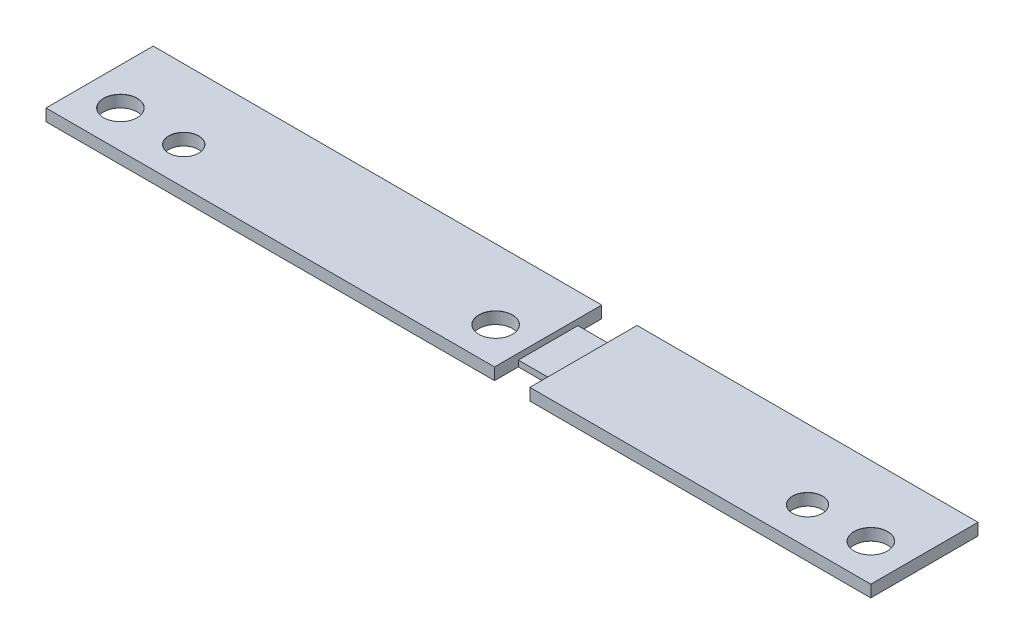
ISO-10303-21;
HEADER;
FILE_DESCRIPTION(('STEP AP214'),'2;1');
FILE_NAME('part.step','',(''),(''),'','','');
FILE_SCHEMA(('AUTOMOTIVE_DESIGN { 1 0 10303 214 1 1 1 1 }'));
ENDSEC;
DATA;
#1=APPLICATION_CONTEXT('core data for automotive mechanical design processes');
#2=APPLICATION_PROTOCOL_DEFINITION('international standard','automotive_design',2000,#1);
#3=PRODUCT_CONTEXT('',#1,'mechanical');
#4=PRODUCT('Part','Part','',(#3));
#5=PRODUCT_RELATED_PRODUCT_CATEGORY('part','',(#4));
#6=PRODUCT_DEFINITION_FORMATION('','',#4);
#7=PRODUCT_DEFINITION_CONTEXT('part definition',#1,'design');
#8=PRODUCT_DEFINITION('design','',#6,#7);
#9=PRODUCT_DEFINITION_SHAPE('','',#8);
#10=(LENGTH_UNIT() NAMED_UNIT(*) SI_UNIT(.MILLI.,.METRE.));
#11=(NAMED_UNIT(*) PLANE_ANGLE_UNIT() SI_UNIT($,.RADIAN.));
#12=(NAMED_UNIT(*) SI_UNIT($,.STERADIAN.) SOLID_ANGLE_UNIT());
#13=UNCERTAINTY_MEASURE_WITH_UNIT(LENGTH_MEASURE(1.E-05),#10,'distance_accuracy_value','');
#14=(GEOMETRIC_REPRESENTATION_CONTEXT(3) GLOBAL_UNCERTAINTY_ASSIGNED_CONTEXT((#13)) GLOBAL_UNIT_ASSIGNED_CONTEXT((#10,
#11,#12)) REPRESENTATION_CONTEXT('',''));
#15=CARTESIAN_POINT('',(0.,0.,0.));
#16=DIRECTION('',(0.,0.,1.));
#17=DIRECTION('',(1.,0.,0.));
#18=AXIS2_PLACEMENT_3D('',#15,#16,#17);
#19=CARTESIAN_POINT('',(0.,0.,0.));
#20=DIRECTION('',(0.,1.,0.));
#21=DIRECTION('',(0.,0.,1.));
#22=AXIS2_PLACEMENT_3D('',#19,#20,#21);
#23=PLANE('',#22);
#24=CARTESIAN_POINT('',(-83.8,0.,4.39999999999999));
#25=DIRECTION('',(0.,1.,0.));
#26=DIRECTION('',(0.,0.,1.));
#27=AXIS2_PLACEMENT_3D('',#24,#25,#26);
#28=CIRCLE('',#27,4.025);
#29=CARTESIAN_POINT('',(-83.8,0.,8.425));
#30=VERTEX_POINT('',#29);
#31=EDGE_CURVE('E569',#30,#30,#28,.T.);
#32=ORIENTED_EDGE('',*,*,#31,.F.);
#33=EDGE_LOOP('',(#32));
#34=FACE_BOUND('',#33,.T.);
#35=CARTESIAN_POINT('',(-100.8,0.,4.39999999999999));
#36=DIRECTION('',(0.,1.,0.));
#37=DIRECTION('',(0.,0.,1.));
#38=AXIS2_PLACEMENT_3D('',#35,#36,#37);
#39=CIRCLE('',#38,4.525);
#40=CARTESIAN_POINT('',(-100.8,0.,8.925));
#41=VERTEX_POINT('',#40);
#42=EDGE_CURVE('E585',#41,#41,#39,.T.);
#43=ORIENTED_EDGE('',*,*,#42,.F.);
#44=EDGE_LOOP('',(#43));
#45=FACE_BOUND('',#44,.T.);
#46=CARTESIAN_POINT('',(0.,0.,4.39999999999999));
#47=DIRECTION('',(0.,1.,0.));
#48=DIRECTION('',(0.,0.,1.));
#49=AXIS2_PLACEMENT_3D('',#46,#47,#48);
#50=CIRCLE('',#49,4.525);
#51=CARTESIAN_POINT('',(0.,0.,8.925));
#52=VERTEX_POINT('',#51);
#53=EDGE_CURVE('E381',#52,#52,#50,.T.);
#54=ORIENTED_EDGE('',*,*,#53,.F.);
#55=EDGE_LOOP('',(#54));
#56=FACE_BOUND('',#55,.T.);
#57=DIRECTION('',(1.,0.,0.));
#58=VECTOR('',#57,1.);
#59=CARTESIAN_POINT('',(-110.8,0.,14.4));
#60=LINE('',#59,#58);
#61=CARTESIAN_POINT('',(-110.8,0.,14.4));
#62=VERTEX_POINT('',#61);
#63=CARTESIAN_POINT('',(9.7,0.,14.4));
#64=VERTEX_POINT('',#63);
#65=EDGE_CURVE('E201',#62,#64,#60,.T.);
#66=ORIENTED_EDGE('',*,*,#65,.T.);
#67=DIRECTION('',(0.,0.,1.));
#68=VECTOR('',#67,1.);
#69=CARTESIAN_POINT('',(9.7,0.,-14.4));
#70=LINE('',#69,#68);
#71=CARTESIAN_POINT('',(9.7,0.,-14.4));
#72=VERTEX_POINT('',#71);
#73=EDGE_CURVE('E164',#72,#64,#70,.T.);
#74=ORIENTED_EDGE('',*,*,#73,.F.);
#75=DIRECTION('',(-1.,0.,0.));
#76=VECTOR('',#75,1.);
#77=CARTESIAN_POINT('',(-110.8,0.,-14.4));
#78=LINE('',#77,#76);
#79=CARTESIAN_POINT('',(-110.8,0.,-14.4));
#80=VERTEX_POINT('',#79);
#81=EDGE_CURVE('E218',#72,#80,#78,.T.);
#82=ORIENTED_EDGE('',*,*,#81,.T.);
#83=DIRECTION('',(0.,0.,1.));
#84=VECTOR('',#83,1.);
#85=CARTESIAN_POINT('',(-110.8,0.,-14.4));
#86=LINE('',#85,#84);
#87=EDGE_CURVE('E222',#80,#62,#86,.T.);
#88=ORIENTED_EDGE('',*,*,#87,.T.);
#89=EDGE_LOOP('',(#66,#74,#82,#88));
#90=FACE_BOUND('',#89,.T.);
#91=ADVANCED_FACE('F43',(#34,#45,#56,#90),#23,.T.);
#92=CARTESIAN_POINT('',(-110.8,-3.2,14.4));
#93=DIRECTION('',(0.,0.,1.));
#94=DIRECTION('',(1.,0.,0.));
#95=AXIS2_PLACEMENT_3D('',#92,#93,#94);
#96=PLANE('',#95);
#97=DIRECTION('',(0.,1.,0.));
#98=VECTOR('',#97,1.);
#99=CARTESIAN_POINT('',(9.7,-3.201,14.4));
#100=LINE('',#99,#98);
#101=CARTESIAN_POINT('',(9.69999999999997,-3.2,14.4));
#102=VERTEX_POINT('',#101);
#103=EDGE_CURVE('E172',#102,#64,#100,.T.);
#104=ORIENTED_EDGE('',*,*,#103,.T.);
#105=ORIENTED_EDGE('',*,*,#65,.F.);
#106=DIRECTION('',(0.,1.,0.));
#107=VECTOR('',#106,1.);
#108=CARTESIAN_POINT('',(-110.8,-3.2,14.4));
#109=LINE('',#108,#107);
#110=CARTESIAN_POINT('',(-110.8,-3.2,14.4));
#111=VERTEX_POINT('',#110);
#112=EDGE_CURVE('E53',#111,#62,#109,.T.);
#113=ORIENTED_EDGE('',*,*,#112,.F.);
#114=DIRECTION('',(1.,0.,0.));
#115=VECTOR('',#114,1.);
#116=CARTESIAN_POINT('',(-110.8,-3.2,14.4));
#117=LINE('',#116,#115);
#118=EDGE_CURVE('E211',#111,#102,#117,.T.);
#119=ORIENTED_EDGE('',*,*,#118,.T.);
#120=EDGE_LOOP('',(#104,#105,#113,#119));
#121=FACE_BOUND('',#120,.T.);
#122=ADVANCED_FACE('F303',(#121),#96,.T.);
#123=CARTESIAN_POINT('',(-110.8,-3.2,-14.4));
#124=DIRECTION('',(0.,0.,-1.));
#125=DIRECTION('',(-1.,0.,0.));
#126=AXIS2_PLACEMENT_3D('',#123,#124,#125);
#127=PLANE('',#126);
#128=DIRECTION('',(0.,1.,0.));
#129=VECTOR('',#128,1.);
#130=CARTESIAN_POINT('',(9.7,-3.201,-14.4));
#131=LINE('',#130,#129);
#132=CARTESIAN_POINT('',(9.7,-3.2,-14.4));
#133=VERTEX_POINT('',#132);
#134=EDGE_CURVE('E171',#133,#72,#131,.T.);
#135=ORIENTED_EDGE('',*,*,#134,.F.);
#136=DIRECTION('',(-1.,0.,0.));
#137=VECTOR('',#136,1.);
#138=CARTESIAN_POINT('',(-110.8,-3.2,-14.4));
#139=LINE('',#138,#137);
#140=CARTESIAN_POINT('',(-110.8,-3.2,-14.4));
#141=VERTEX_POINT('',#140);
#142=EDGE_CURVE('E200',#133,#141,#139,.T.);
#143=ORIENTED_EDGE('',*,*,#142,.T.);
#144=DIRECTION('',(0.,1.,0.));
#145=VECTOR('',#144,1.);
#146=CARTESIAN_POINT('',(-110.8,-3.2,-14.4));
#147=LINE('',#146,#145);
#148=EDGE_CURVE('E231',#141,#80,#147,.T.);
#149=ORIENTED_EDGE('',*,*,#148,.T.);
#150=ORIENTED_EDGE('',*,*,#81,.F.);
#151=EDGE_LOOP('',(#135,#143,#149,#150));
#152=FACE_BOUND('',#151,.T.);
#153=ADVANCED_FACE('F295',(#152),#127,.T.);
#154=CARTESIAN_POINT('',(110.8,-3.2,-14.4));
#155=DIRECTION('',(1.,0.,0.));
#156=DIRECTION('',(0.,0.,-1.));
#157=AXIS2_PLACEMENT_3D('',#154,#155,#156);
#158=PLANE('',#157);
#159=DIRECTION('',(0.,0.,-1.));
#160=VECTOR('',#159,1.);
#161=CARTESIAN_POINT('',(110.8,0.,-14.4));
#162=LINE('',#161,#160);
#163=CARTESIAN_POINT('',(110.8,0.,14.4));
#164=VERTEX_POINT('',#163);
#165=CARTESIAN_POINT('',(110.8,0.,-14.4));
#166=VERTEX_POINT('',#165);
#167=EDGE_CURVE('E170',#164,#166,#162,.T.);
#168=ORIENTED_EDGE('',*,*,#167,.F.);
#169=DIRECTION('',(0.,1.,0.));
#170=VECTOR('',#169,1.);
#171=CARTESIAN_POINT('',(110.8,-3.2,14.4));
#172=LINE('',#171,#170);
#173=CARTESIAN_POINT('',(110.8,-3.2,14.4));
#174=VERTEX_POINT('',#173);
#175=EDGE_CURVE('E11',#174,#164,#172,.T.);
#176=ORIENTED_EDGE('',*,*,#175,.F.);
#177=DIRECTION('',(0.,0.,-1.));
#178=VECTOR('',#177,1.);
#179=CARTESIAN_POINT('',(110.8,-3.2,-14.4));
#180=LINE('',#179,#178);
#181=CARTESIAN_POINT('',(110.8,-3.2,-14.4));
#182=VERTEX_POINT('',#181);
#183=EDGE_CURVE('E196',#174,#182,#180,.T.);
#184=ORIENTED_EDGE('',*,*,#183,.T.);
#185=DIRECTION('',(0.,1.,0.));
#186=VECTOR('',#185,1.);
#187=CARTESIAN_POINT('',(110.8,-3.2,-14.4));
#188=LINE('',#187,#186);
#189=EDGE_CURVE('E47',#182,#166,#188,.T.);
#190=ORIENTED_EDGE('',*,*,#189,.T.);
#191=EDGE_LOOP('',(#168,#176,#184,#190));
#192=FACE_BOUND('',#191,.T.);
#193=ADVANCED_FACE('F45',(#192),#158,.T.);
#194=DIRECTION('',(0.,1.,0.));
#195=VECTOR('',#194,1.);
#196=CARTESIAN_POINT('',(19.2,-3.201,14.4));
#197=LINE('',#196,#195);
#198=CARTESIAN_POINT('',(19.2,-3.2,14.4));
#199=VERTEX_POINT('',#198);
#200=CARTESIAN_POINT('',(19.1999999999999,0.,14.4));
#201=VERTEX_POINT('',#200);
#202=EDGE_CURVE('E177',#199,#201,#197,.T.);
#203=ORIENTED_EDGE('',*,*,#202,.F.);
#204=EDGE_CURVE('E210',#199,#174,#117,.T.);
#205=ORIENTED_EDGE('',*,*,#204,.T.);
#206=ORIENTED_EDGE('',*,*,#175,.T.);
#207=EDGE_CURVE('E226',#201,#164,#60,.T.);
#208=ORIENTED_EDGE('',*,*,#207,.F.);
#209=EDGE_LOOP('',(#203,#205,#206,#208));
#210=FACE_BOUND('',#209,.T.);
#211=ADVANCED_FACE('F255',(#210),#96,.T.);
#212=CARTESIAN_POINT('',(-110.8,-3.2,-14.4));
#213=DIRECTION('',(-1.,0.,0.));
#214=DIRECTION('',(0.,0.,1.));
#215=AXIS2_PLACEMENT_3D('',#212,#213,#214);
#216=PLANE('',#215);
#217=ORIENTED_EDGE('',*,*,#87,.F.);
#218=ORIENTED_EDGE('',*,*,#148,.F.);
#219=DIRECTION('',(0.,0.,1.));
#220=VECTOR('',#219,1.);
#221=CARTESIAN_POINT('',(-110.8,-3.2,-14.4));
#222=LINE('',#221,#220);
#223=EDGE_CURVE('E206',#141,#111,#222,.T.);
#224=ORIENTED_EDGE('',*,*,#223,.T.);
#225=ORIENTED_EDGE('',*,*,#112,.T.);
#226=EDGE_LOOP('',(#217,#218,#224,#225));
#227=FACE_BOUND('',#226,.T.);
#228=ADVANCED_FACE('F298',(#227),#216,.T.);
#229=DIRECTION('',(0.,1.,0.));
#230=VECTOR('',#229,1.);
#231=CARTESIAN_POINT('',(19.2,-3.201,-14.4));
#232=LINE('',#231,#230);
#233=CARTESIAN_POINT('',(19.2,-3.2,-14.4));
#234=VERTEX_POINT('',#233);
#235=CARTESIAN_POINT('',(19.2,0.,-14.4));
#236=VERTEX_POINT('',#235);
#237=EDGE_CURVE('E162',#234,#236,#232,.T.);
#238=ORIENTED_EDGE('',*,*,#237,.T.);
#239=EDGE_CURVE('E219',#166,#236,#78,.T.);
#240=ORIENTED_EDGE('',*,*,#239,.F.);
#241=ORIENTED_EDGE('',*,*,#189,.F.);
#242=EDGE_CURVE('E202',#182,#234,#139,.T.);
#243=ORIENTED_EDGE('',*,*,#242,.T.);
#244=EDGE_LOOP('',(#238,#240,#241,#243));
#245=FACE_BOUND('',#244,.T.);
#246=ADVANCED_FACE('F249',(#245),#127,.T.);
#247=CARTESIAN_POINT('',(0.,-3.2,0.));
#248=DIRECTION('',(0.,1.,0.));
#249=DIRECTION('',(0.,0.,1.));
#250=AXIS2_PLACEMENT_3D('',#247,#248,#249);
#251=PLANE('',#250);
#252=CARTESIAN_POINT('',(83.8,-3.2,4.39999999999998));
#253=DIRECTION('',(0.,1.,0.));
#254=DIRECTION('',(0.,0.,1.));
#255=AXIS2_PLACEMENT_3D('',#252,#253,#254);
#256=CIRCLE('',#255,4.025);
#257=CARTESIAN_POINT('',(83.8,-3.2,8.42499999999998));
#258=VERTEX_POINT('',#257);
#259=EDGE_CURVE('E552',#258,#258,#256,.T.);
#260=ORIENTED_EDGE('',*,*,#259,.T.);
#261=EDGE_LOOP('',(#260));
#262=FACE_BOUND('',#261,.T.);
#263=CARTESIAN_POINT('',(-83.8,-3.2,4.39999999999999));
#264=DIRECTION('',(0.,1.,0.));
#265=DIRECTION('',(0.,0.,1.));
#266=AXIS2_PLACEMENT_3D('',#263,#264,#265);
#267=CIRCLE('',#266,4.025);
#268=CARTESIAN_POINT('',(-83.8,-3.2,8.425));
#269=VERTEX_POINT('',#268);
#270=EDGE_CURVE('E565',#269,#269,#267,.T.);
#271=ORIENTED_EDGE('',*,*,#270,.T.);
#272=EDGE_LOOP('',(#271));
#273=FACE_BOUND('',#272,.T.);
#274=CARTESIAN_POINT('',(-100.8,-3.2,4.39999999999999));
#275=DIRECTION('',(0.,1.,0.));
#276=DIRECTION('',(0.,0.,1.));
#277=AXIS2_PLACEMENT_3D('',#274,#275,#276);
#278=CIRCLE('',#277,4.525);
#279=CARTESIAN_POINT('',(-100.8,-3.2,8.925));
#280=VERTEX_POINT('',#279);
#281=EDGE_CURVE('E581',#280,#280,#278,.T.);
#282=ORIENTED_EDGE('',*,*,#281,.T.);
#283=EDGE_LOOP('',(#282));
#284=FACE_BOUND('',#283,.T.);
#285=CARTESIAN_POINT('',(100.8,-3.2,4.39999999999999));
#286=DIRECTION('',(0.,1.,0.));
#287=DIRECTION('',(0.,0.,1.));
#288=AXIS2_PLACEMENT_3D('',#285,#286,#287);
#289=CIRCLE('',#288,4.525);
#290=CARTESIAN_POINT('',(100.8,-3.2,8.92499999999999));
#291=VERTEX_POINT('',#290);
#292=EDGE_CURVE('E361',#291,#291,#289,.T.);
#293=ORIENTED_EDGE('',*,*,#292,.T.);
#294=EDGE_LOOP('',(#293));
#295=FACE_BOUND('',#294,.T.);
#296=CARTESIAN_POINT('',(0.,-3.2,4.39999999999999));
#297=DIRECTION('',(0.,1.,0.));
#298=DIRECTION('',(0.,0.,1.));
#299=AXIS2_PLACEMENT_3D('',#296,#297,#298);
#300=CIRCLE('',#299,4.525);
#301=CARTESIAN_POINT('',(0.,-3.2,8.92499999999999));
#302=VERTEX_POINT('',#301);
#303=EDGE_CURVE('E377',#302,#302,#300,.T.);
#304=ORIENTED_EDGE('',*,*,#303,.T.);
#305=EDGE_LOOP('',(#304));
#306=FACE_BOUND('',#305,.T.);
#307=ORIENTED_EDGE('',*,*,#142,.F.);
#308=DIRECTION('',(0.,0.,-1.));
#309=VECTOR('',#308,1.);
#310=CARTESIAN_POINT('',(9.7,-3.2,-14.4));
#311=LINE('',#310,#309);
#312=CARTESIAN_POINT('',(9.7,-3.2,-8.));
#313=VERTEX_POINT('',#312);
#314=EDGE_CURVE('E265',#313,#133,#311,.T.);
#315=ORIENTED_EDGE('',*,*,#314,.F.);
#316=DIRECTION('',(-1.,0.,0.));
#317=VECTOR('',#316,1.);
#318=CARTESIAN_POINT('',(9.7,-3.2,-8.));
#319=LINE('',#318,#317);
#320=CARTESIAN_POINT('',(19.2,-3.2,-8.));
#321=VERTEX_POINT('',#320);
#322=EDGE_CURVE('E154',#321,#313,#319,.T.);
#323=ORIENTED_EDGE('',*,*,#322,.F.);
#324=DIRECTION('',(0.,0.,1.));
#325=VECTOR('',#324,1.);
#326=CARTESIAN_POINT('',(19.2,-3.2,-14.4));
#327=LINE('',#326,#325);
#328=EDGE_CURVE('E195',#234,#321,#327,.T.);
#329=ORIENTED_EDGE('',*,*,#328,.F.);
#330=ORIENTED_EDGE('',*,*,#242,.F.);
#331=ORIENTED_EDGE('',*,*,#183,.F.);
#332=ORIENTED_EDGE('',*,*,#204,.F.);
#333=DIRECTION('',(0.,0.,1.));
#334=VECTOR('',#333,1.);
#335=CARTESIAN_POINT('',(19.2,-3.2,14.4));
#336=LINE('',#335,#334);
#337=CARTESIAN_POINT('',(19.2,-3.2,8.));
#338=VERTEX_POINT('',#337);
#339=EDGE_CURVE('E192',#338,#199,#336,.T.);
#340=ORIENTED_EDGE('',*,*,#339,.F.);
#341=DIRECTION('',(1.,0.,0.));
#342=VECTOR('',#341,1.);
#343=CARTESIAN_POINT('',(9.7,-3.2,8.));
#344=LINE('',#343,#342);
#345=CARTESIAN_POINT('',(9.7,-3.2,8.));
#346=VERTEX_POINT('',#345);
#347=EDGE_CURVE('E188',#346,#338,#344,.T.);
#348=ORIENTED_EDGE('',*,*,#347,.F.);
#349=DIRECTION('',(0.,0.,-1.));
#350=VECTOR('',#349,1.);
#351=CARTESIAN_POINT('',(9.7,-3.2,14.4));
#352=LINE('',#351,#350);
#353=EDGE_CURVE('E176',#102,#346,#352,.T.);
#354=ORIENTED_EDGE('',*,*,#353,.F.);
#355=ORIENTED_EDGE('',*,*,#118,.F.);
#356=ORIENTED_EDGE('',*,*,#223,.F.);
#357=EDGE_LOOP('',(#307,#315,#323,#329,#330,#331,#332,#340,#348,#354,#355,#356));
#358=FACE_BOUND('',#357,.T.);
#359=ADVANCED_FACE('F259',(#262,#273,#284,#295,#306,#358),#251,.F.);
#360=CARTESIAN_POINT('',(83.8,0.,4.39999999999998));
#361=DIRECTION('',(0.,1.,0.));
#362=DIRECTION('',(0.,0.,1.));
#363=AXIS2_PLACEMENT_3D('',#360,#361,#362);
#364=CIRCLE('',#363,4.025);
#365=CARTESIAN_POINT('',(83.8,0.,8.42499999999998));
#366=VERTEX_POINT('',#365);
#367=EDGE_CURVE('E354',#366,#366,#364,.T.);
#368=ORIENTED_EDGE('',*,*,#367,.F.);
#369=EDGE_LOOP('',(#368));
#370=FACE_BOUND('',#369,.T.);
#371=CARTESIAN_POINT('',(100.8,0.,4.39999999999999));
#372=DIRECTION('',(0.,1.,0.));
#373=DIRECTION('',(0.,0.,1.));
#374=AXIS2_PLACEMENT_3D('',#371,#372,#373);
#375=CIRCLE('',#374,4.525);
#376=CARTESIAN_POINT('',(100.8,0.,8.92499999999999));
#377=VERTEX_POINT('',#376);
#378=EDGE_CURVE('E357',#377,#377,#375,.T.);
#379=ORIENTED_EDGE('',*,*,#378,.F.);
#380=EDGE_LOOP('',(#379));
#381=FACE_BOUND('',#380,.T.);
#382=DIRECTION('',(0.,0.,-1.));
#383=VECTOR('',#382,1.);
#384=CARTESIAN_POINT('',(19.2,0.,-14.4));
#385=LINE('',#384,#383);
#386=EDGE_CURVE('E69',#201,#236,#385,.T.);
#387=ORIENTED_EDGE('',*,*,#386,.F.);
#388=ORIENTED_EDGE('',*,*,#207,.T.);
#389=ORIENTED_EDGE('',*,*,#167,.T.);
#390=ORIENTED_EDGE('',*,*,#239,.T.);
#391=EDGE_LOOP('',(#387,#388,#389,#390));
#392=FACE_BOUND('',#391,.T.);
#393=ADVANCED_FACE('F250',(#370,#381,#392),#23,.T.);
#394=CARTESIAN_POINT('',(9.7,-3.201,8.));
#395=DIRECTION('',(0.,0.,-1.));
#396=DIRECTION('',(-1.,0.,0.));
#397=AXIS2_PLACEMENT_3D('',#394,#395,#396);
#398=PLANE('',#397);
#399=DIRECTION('',(0.,1.,0.));
#400=VECTOR('',#399,1.);
#401=CARTESIAN_POINT('',(19.2,-3.201,8.));
#402=LINE('',#401,#400);
#403=CARTESIAN_POINT('',(19.2,-1.6,8.));
#404=VERTEX_POINT('',#403);
#405=EDGE_CURVE('E180',#338,#404,#402,.T.);
#406=ORIENTED_EDGE('',*,*,#405,.T.);
#407=DIRECTION('',(1.,0.,0.));
#408=VECTOR('',#407,1.);
#409=CARTESIAN_POINT('',(9.7,-1.6,8.));
#410=LINE('',#409,#408);
#411=CARTESIAN_POINT('',(9.7,-1.6,8.));
#412=VERTEX_POINT('',#411);
#413=EDGE_CURVE('E144',#412,#404,#410,.T.);
#414=ORIENTED_EDGE('',*,*,#413,.F.);
#415=DIRECTION('',(0.,1.,0.));
#416=VECTOR('',#415,1.);
#417=CARTESIAN_POINT('',(9.7,-3.201,8.));
#418=LINE('',#417,#416);
#419=EDGE_CURVE('E141',#346,#412,#418,.T.);
#420=ORIENTED_EDGE('',*,*,#419,.F.);
#421=ORIENTED_EDGE('',*,*,#347,.T.);
#422=EDGE_LOOP('',(#406,#414,#420,#421));
#423=FACE_BOUND('',#422,.T.);
#424=ADVANCED_FACE('F308',(#423),#398,.F.);
#425=CARTESIAN_POINT('',(9.7,-3.201,-14.4));
#426=DIRECTION('',(-1.,0.,0.));
#427=DIRECTION('',(0.,0.,1.));
#428=AXIS2_PLACEMENT_3D('',#425,#426,#427);
#429=PLANE('',#428);
#430=ORIENTED_EDGE('',*,*,#314,.T.);
#431=ORIENTED_EDGE('',*,*,#134,.T.);
#432=ORIENTED_EDGE('',*,*,#73,.T.);
#433=ORIENTED_EDGE('',*,*,#103,.F.);
#434=ORIENTED_EDGE('',*,*,#353,.T.);
#435=ORIENTED_EDGE('',*,*,#419,.T.);
#436=DIRECTION('',(0.,0.,1.));
#437=VECTOR('',#436,1.);
#438=CARTESIAN_POINT('',(9.7,-1.6,-14.401));
#439=LINE('',#438,#437);
#440=CARTESIAN_POINT('',(9.7,-1.6,-8.));
#441=VERTEX_POINT('',#440);
#442=EDGE_CURVE('E135',#441,#412,#439,.T.);
#443=ORIENTED_EDGE('',*,*,#442,.F.);
#444=DIRECTION('',(0.,1.,0.));
#445=VECTOR('',#444,1.);
#446=CARTESIAN_POINT('',(9.7,-3.201,-8.));
#447=LINE('',#446,#445);
#448=EDGE_CURVE('E138',#313,#441,#447,.T.);
#449=ORIENTED_EDGE('',*,*,#448,.F.);
#450=EDGE_LOOP('',(#430,#431,#432,#433,#434,#435,#443,#449));
#451=FACE_BOUND('',#450,.T.);
#452=ADVANCED_FACE('F136',(#451),#429,.F.);
#453=CARTESIAN_POINT('',(19.2,-3.201,-14.4));
#454=DIRECTION('',(1.,0.,0.));
#455=DIRECTION('',(0.,0.,-1.));
#456=AXIS2_PLACEMENT_3D('',#453,#454,#455);
#457=PLANE('',#456);
#458=ORIENTED_EDGE('',*,*,#328,.T.);
#459=DIRECTION('',(0.,1.,0.));
#460=VECTOR('',#459,1.);
#461=CARTESIAN_POINT('',(19.2,-3.201,-8.));
#462=LINE('',#461,#460);
#463=CARTESIAN_POINT('',(19.2,-1.6,-8.));
#464=VERTEX_POINT('',#463);
#465=EDGE_CURVE('E157',#321,#464,#462,.T.);
#466=ORIENTED_EDGE('',*,*,#465,.T.);
#467=DIRECTION('',(0.,0.,1.));
#468=VECTOR('',#467,1.);
#469=CARTESIAN_POINT('',(19.2,-1.6,-14.401));
#470=LINE('',#469,#468);
#471=EDGE_CURVE('E61',#464,#404,#470,.T.);
#472=ORIENTED_EDGE('',*,*,#471,.T.);
#473=ORIENTED_EDGE('',*,*,#405,.F.);
#474=ORIENTED_EDGE('',*,*,#339,.T.);
#475=ORIENTED_EDGE('',*,*,#202,.T.);
#476=ORIENTED_EDGE('',*,*,#386,.T.);
#477=ORIENTED_EDGE('',*,*,#237,.F.);
#478=EDGE_LOOP('',(#458,#466,#472,#473,#474,#475,#476,#477));
#479=FACE_BOUND('',#478,.T.);
#480=ADVANCED_FACE('F321',(#479),#457,.F.);
#481=CARTESIAN_POINT('',(9.7,-3.201,-8.));
#482=DIRECTION('',(0.,0.,1.));
#483=DIRECTION('',(1.,0.,0.));
#484=AXIS2_PLACEMENT_3D('',#481,#482,#483);
#485=PLANE('',#484);
#486=ORIENTED_EDGE('',*,*,#448,.T.);
#487=DIRECTION('',(-1.,0.,0.));
#488=VECTOR('',#487,1.);
#489=CARTESIAN_POINT('',(9.7,-1.6,-8.));
#490=LINE('',#489,#488);
#491=EDGE_CURVE('E146',#464,#441,#490,.T.);
#492=ORIENTED_EDGE('',*,*,#491,.F.);
#493=ORIENTED_EDGE('',*,*,#465,.F.);
#494=ORIENTED_EDGE('',*,*,#322,.T.);
#495=EDGE_LOOP('',(#486,#492,#493,#494));
#496=FACE_BOUND('',#495,.T.);
#497=ADVANCED_FACE('F152',(#496),#485,.F.);
#498=CARTESIAN_POINT('',(9.7,-1.6,-14.401));
#499=DIRECTION('',(0.,-1.,0.));
#500=DIRECTION('',(0.,0.,-1.));
#501=AXIS2_PLACEMENT_3D('',#498,#499,#500);
#502=PLANE('',#501);
#503=ORIENTED_EDGE('',*,*,#491,.T.);
#504=ORIENTED_EDGE('',*,*,#442,.T.);
#505=ORIENTED_EDGE('',*,*,#413,.T.);
#506=ORIENTED_EDGE('',*,*,#471,.F.);
#507=EDGE_LOOP('',(#503,#504,#505,#506));
#508=FACE_BOUND('',#507,.T.);
#509=ADVANCED_FACE('F147',(#508),#502,.F.);
#510=CARTESIAN_POINT('',(0.,-3.175,4.39999999999999));
#511=DIRECTION('',(0.,-1.,0.));
#512=DIRECTION('',(0.,0.,-1.));
#513=AXIS2_PLACEMENT_3D('',#510,#511,#512);
#514=CONICAL_SURFACE('',#513,4.5,0.785398163397422);
#515=ORIENTED_EDGE('',*,*,#303,.F.);
#516=EDGE_LOOP('',(#515));
#517=FACE_BOUND('',#516,.T.);
#518=CARTESIAN_POINT('',(0.,-3.175,4.39999999999999));
#519=DIRECTION('',(0.,1.,0.));
#520=DIRECTION('',(0.,0.,1.));
#521=AXIS2_PLACEMENT_3D('',#518,#519,#520);
#522=CIRCLE('',#521,4.5);
#523=CARTESIAN_POINT('',(0.,-3.175,8.9));
#524=VERTEX_POINT('',#523);
#525=EDGE_CURVE('E310',#524,#524,#522,.T.);
#526=ORIENTED_EDGE('',*,*,#525,.T.);
#527=EDGE_LOOP('',(#526));
#528=FACE_BOUND('',#527,.T.);
#529=ADVANCED_FACE('F405',(#517,#528),#514,.F.);
#530=CARTESIAN_POINT('',(0.,0.,4.39999999999999));
#531=DIRECTION('',(0.,1.,0.));
#532=DIRECTION('',(0.,0.,1.));
#533=AXIS2_PLACEMENT_3D('',#530,#531,#532);
#534=CYLINDRICAL_SURFACE('',#533,4.5);
#535=ORIENTED_EDGE('',*,*,#525,.F.);
#536=EDGE_LOOP('',(#535));
#537=FACE_BOUND('',#536,.T.);
#538=CARTESIAN_POINT('',(0.,-0.0249999999999959,4.39999999999999));
#539=DIRECTION('',(0.,1.,0.));
#540=DIRECTION('',(0.,0.,1.));
#541=AXIS2_PLACEMENT_3D('',#538,#539,#540);
#542=CIRCLE('',#541,4.5);
#543=CARTESIAN_POINT('',(0.,-0.0249999999999959,8.9));
#544=VERTEX_POINT('',#543);
#545=EDGE_CURVE('E315',#544,#544,#542,.T.);
#546=ORIENTED_EDGE('',*,*,#545,.T.);
#547=EDGE_LOOP('',(#546));
#548=FACE_BOUND('',#547,.T.);
#549=ADVANCED_FACE('F389',(#537,#548),#534,.F.);
#550=CARTESIAN_POINT('',(0.,0.,4.39999999999999));
#551=DIRECTION('',(0.,1.,0.));
#552=DIRECTION('',(0.,0.,1.));
#553=AXIS2_PLACEMENT_3D('',#550,#551,#552);
#554=CONICAL_SURFACE('',#553,4.525,0.785398163397526);
#555=ORIENTED_EDGE('',*,*,#545,.F.);
#556=EDGE_LOOP('',(#555));
#557=FACE_BOUND('',#556,.T.);
#558=ORIENTED_EDGE('',*,*,#53,.T.);
#559=EDGE_LOOP('',(#558));
#560=FACE_BOUND('',#559,.T.);
#561=ADVANCED_FACE('F391',(#557,#560),#554,.F.);
#562=CARTESIAN_POINT('',(100.8,-3.175,4.39999999999999));
#563=DIRECTION('',(0.,-1.,0.));
#564=DIRECTION('',(0.,0.,-1.));
#565=AXIS2_PLACEMENT_3D('',#562,#563,#564);
#566=CONICAL_SURFACE('',#565,4.5,0.785398163397388);
#567=ORIENTED_EDGE('',*,*,#292,.F.);
#568=EDGE_LOOP('',(#567));
#569=FACE_BOUND('',#568,.T.);
#570=CARTESIAN_POINT('',(100.8,-3.175,4.39999999999999));
#571=DIRECTION('',(0.,1.,0.));
#572=DIRECTION('',(0.,0.,1.));
#573=AXIS2_PLACEMENT_3D('',#570,#571,#572);
#574=CIRCLE('',#573,4.5);
#575=CARTESIAN_POINT('',(100.8,-3.175,8.89999999999999));
#576=VERTEX_POINT('',#575);
#577=EDGE_CURVE('E367',#576,#576,#574,.T.);
#578=ORIENTED_EDGE('',*,*,#577,.T.);
#579=EDGE_LOOP('',(#578));
#580=FACE_BOUND('',#579,.T.);
#581=ADVANCED_FACE('F394',(#569,#580),#566,.F.);
#582=CARTESIAN_POINT('',(100.8,0.,4.39999999999999));
#583=DIRECTION('',(0.,1.,0.));
#584=DIRECTION('',(0.,0.,1.));
#585=AXIS2_PLACEMENT_3D('',#582,#583,#584);
#586=CYLINDRICAL_SURFACE('',#585,4.5);
#587=ORIENTED_EDGE('',*,*,#577,.F.);
#588=EDGE_LOOP('',(#587));
#589=FACE_BOUND('',#588,.T.);
#590=CARTESIAN_POINT('',(100.8,-0.0249999999999959,4.39999999999999));
#591=DIRECTION('',(0.,1.,0.));
#592=DIRECTION('',(0.,0.,1.));
#593=AXIS2_PLACEMENT_3D('',#590,#591,#592);
#594=CIRCLE('',#593,4.5);
#595=CARTESIAN_POINT('',(100.8,-0.0249999999999959,8.89999999999999));
#596=VERTEX_POINT('',#595);
#597=EDGE_CURVE('E360',#596,#596,#594,.T.);
#598=ORIENTED_EDGE('',*,*,#597,.T.);
#599=EDGE_LOOP('',(#598));
#600=FACE_BOUND('',#599,.T.);
#601=ADVANCED_FACE('F402',(#589,#600),#586,.F.);
#602=CARTESIAN_POINT('',(100.8,0.,4.39999999999999));
#603=DIRECTION('',(0.,1.,0.));
#604=DIRECTION('',(0.,0.,1.));
#605=AXIS2_PLACEMENT_3D('',#602,#603,#604);
#606=CONICAL_SURFACE('',#605,4.525,0.785398163397474);
#607=ORIENTED_EDGE('',*,*,#597,.F.);
#608=EDGE_LOOP('',(#607));
#609=FACE_BOUND('',#608,.T.);
#610=ORIENTED_EDGE('',*,*,#378,.T.);
#611=EDGE_LOOP('',(#610));
#612=FACE_BOUND('',#611,.T.);
#613=ADVANCED_FACE('F447',(#609,#612),#606,.F.);
#614=CARTESIAN_POINT('',(-100.8,-3.175,4.39999999999999));
#615=DIRECTION('',(0.,-1.,0.));
#616=DIRECTION('',(0.,0.,-1.));
#617=AXIS2_PLACEMENT_3D('',#614,#615,#616);
#618=CONICAL_SURFACE('',#617,4.5,0.785398163397388);
#619=ORIENTED_EDGE('',*,*,#281,.F.);
#620=EDGE_LOOP('',(#619));
#621=FACE_BOUND('',#620,.T.);
#622=CARTESIAN_POINT('',(-100.8,-3.175,4.39999999999999));
#623=DIRECTION('',(0.,1.,0.));
#624=DIRECTION('',(0.,0.,1.));
#625=AXIS2_PLACEMENT_3D('',#622,#623,#624);
#626=CIRCLE('',#625,4.5);
#627=CARTESIAN_POINT('',(-100.8,-3.175,8.9));
#628=VERTEX_POINT('',#627);
#629=EDGE_CURVE('E370',#628,#628,#626,.T.);
#630=ORIENTED_EDGE('',*,*,#629,.T.);
#631=EDGE_LOOP('',(#630));
#632=FACE_BOUND('',#631,.T.);
#633=ADVANCED_FACE('F456',(#621,#632),#618,.F.);
#634=CARTESIAN_POINT('',(-100.8,0.,4.39999999999999));
#635=DIRECTION('',(0.,1.,0.));
#636=DIRECTION('',(0.,0.,1.));
#637=AXIS2_PLACEMENT_3D('',#634,#635,#636);
#638=CYLINDRICAL_SURFACE('',#637,4.5);
#639=ORIENTED_EDGE('',*,*,#629,.F.);
#640=EDGE_LOOP('',(#639));
#641=FACE_BOUND('',#640,.T.);
#642=CARTESIAN_POINT('',(-100.8,-0.0249999999999959,4.39999999999999));
#643=DIRECTION('',(0.,1.,0.));
#644=DIRECTION('',(0.,0.,1.));
#645=AXIS2_PLACEMENT_3D('',#642,#643,#644);
#646=CIRCLE('',#645,4.5);
#647=CARTESIAN_POINT('',(-100.8,-0.0249999999999959,8.9));
#648=VERTEX_POINT('',#647);
#649=EDGE_CURVE('E589',#648,#648,#646,.T.);
#650=ORIENTED_EDGE('',*,*,#649,.T.);
#651=EDGE_LOOP('',(#650));
#652=FACE_BOUND('',#651,.T.);
#653=ADVANCED_FACE('F466',(#641,#652),#638,.F.);
#654=CARTESIAN_POINT('',(-100.8,0.,4.39999999999999));
#655=DIRECTION('',(0.,1.,0.));
#656=DIRECTION('',(0.,0.,1.));
#657=AXIS2_PLACEMENT_3D('',#654,#655,#656);
#658=CONICAL_SURFACE('',#657,4.525,0.785398163397474);
#659=ORIENTED_EDGE('',*,*,#649,.F.);
#660=EDGE_LOOP('',(#659));
#661=FACE_BOUND('',#660,.T.);
#662=ORIENTED_EDGE('',*,*,#42,.T.);
#663=EDGE_LOOP('',(#662));
#664=FACE_BOUND('',#663,.T.);
#665=ADVANCED_FACE('F476',(#661,#664),#658,.F.);
#666=CARTESIAN_POINT('',(-83.8,-3.175,4.39999999999999));
#667=DIRECTION('',(0.,-1.,0.));
#668=DIRECTION('',(0.,0.,-1.));
#669=AXIS2_PLACEMENT_3D('',#666,#667,#668);
#670=CONICAL_SURFACE('',#669,4.,0.78539816339731);
#671=ORIENTED_EDGE('',*,*,#270,.F.);
#672=EDGE_LOOP('',(#671));
#673=FACE_BOUND('',#672,.T.);
#674=CARTESIAN_POINT('',(-83.8,-3.175,4.39999999999999));
#675=DIRECTION('',(0.,1.,0.));
#676=DIRECTION('',(0.,0.,1.));
#677=AXIS2_PLACEMENT_3D('',#674,#675,#676);
#678=CIRCLE('',#677,4.);
#679=CARTESIAN_POINT('',(-83.8,-3.175,8.4));
#680=VERTEX_POINT('',#679);
#681=EDGE_CURVE('E577',#680,#680,#678,.T.);
#682=ORIENTED_EDGE('',*,*,#681,.T.);
#683=EDGE_LOOP('',(#682));
#684=FACE_BOUND('',#683,.T.);
#685=ADVANCED_FACE('F485',(#673,#684),#670,.F.);
#686=CARTESIAN_POINT('',(-83.8,0.,4.39999999999999));
#687=DIRECTION('',(0.,1.,0.));
#688=DIRECTION('',(0.,0.,1.));
#689=AXIS2_PLACEMENT_3D('',#686,#687,#688);
#690=CYLINDRICAL_SURFACE('',#689,4.);
#691=ORIENTED_EDGE('',*,*,#681,.F.);
#692=EDGE_LOOP('',(#691));
#693=FACE_BOUND('',#692,.T.);
#694=CARTESIAN_POINT('',(-83.8,-0.0249999999999972,4.39999999999999));
#695=DIRECTION('',(0.,1.,0.));
#696=DIRECTION('',(0.,0.,1.));
#697=AXIS2_PLACEMENT_3D('',#694,#695,#696);
#698=CIRCLE('',#697,4.);
#699=CARTESIAN_POINT('',(-83.8,-0.0249999999999972,8.4));
#700=VERTEX_POINT('',#699);
#701=EDGE_CURVE('E573',#700,#700,#698,.T.);
#702=ORIENTED_EDGE('',*,*,#701,.T.);
#703=EDGE_LOOP('',(#702));
#704=FACE_BOUND('',#703,.T.);
#705=ADVANCED_FACE('F494',(#693,#704),#690,.F.);
#706=CARTESIAN_POINT('',(-83.8,0.,4.39999999999999));
#707=DIRECTION('',(0.,1.,0.));
#708=DIRECTION('',(0.,0.,1.));
#709=AXIS2_PLACEMENT_3D('',#706,#707,#708);
#710=CONICAL_SURFACE('',#709,4.025,0.785398163397448);
#711=ORIENTED_EDGE('',*,*,#701,.F.);
#712=EDGE_LOOP('',(#711));
#713=FACE_BOUND('',#712,.T.);
#714=ORIENTED_EDGE('',*,*,#31,.T.);
#715=EDGE_LOOP('',(#714));
#716=FACE_BOUND('',#715,.T.);
#717=ADVANCED_FACE('F504',(#713,#716),#710,.F.);
#718=CARTESIAN_POINT('',(83.8,-3.175,4.39999999999998));
#719=DIRECTION('',(0.,-1.,0.));
#720=DIRECTION('',(0.,0.,-1.));
#721=AXIS2_PLACEMENT_3D('',#718,#719,#720);
#722=CONICAL_SURFACE('',#721,4.,0.78539816339731);
#723=ORIENTED_EDGE('',*,*,#259,.F.);
#724=EDGE_LOOP('',(#723));
#725=FACE_BOUND('',#724,.T.);
#726=CARTESIAN_POINT('',(83.8,-3.175,4.39999999999998));
#727=DIRECTION('',(0.,1.,0.));
#728=DIRECTION('',(0.,0.,1.));
#729=AXIS2_PLACEMENT_3D('',#726,#727,#728);
#730=CIRCLE('',#729,4.);
#731=CARTESIAN_POINT('',(83.8,-3.175,8.39999999999998));
#732=VERTEX_POINT('',#731);
#733=EDGE_CURVE('E557',#732,#732,#730,.T.);
#734=ORIENTED_EDGE('',*,*,#733,.T.);
#735=EDGE_LOOP('',(#734));
#736=FACE_BOUND('',#735,.T.);
#737=ADVANCED_FACE('F514',(#725,#736),#722,.F.);
#738=CARTESIAN_POINT('',(83.8,0.,4.39999999999998));
#739=DIRECTION('',(0.,1.,0.));
#740=DIRECTION('',(0.,0.,1.));
#741=AXIS2_PLACEMENT_3D('',#738,#739,#740);
#742=CYLINDRICAL_SURFACE('',#741,4.);
#743=ORIENTED_EDGE('',*,*,#733,.F.);
#744=EDGE_LOOP('',(#743));
#745=FACE_BOUND('',#744,.T.);
#746=CARTESIAN_POINT('',(83.8,-0.0249999999999972,4.39999999999998));
#747=DIRECTION('',(0.,1.,0.));
#748=DIRECTION('',(0.,0.,1.));
#749=AXIS2_PLACEMENT_3D('',#746,#747,#748);
#750=CIRCLE('',#749,3.99999999999999);
#751=CARTESIAN_POINT('',(83.8,-0.0249999999999972,8.39999999999997));
#752=VERTEX_POINT('',#751);
#753=EDGE_CURVE('E550',#752,#752,#750,.T.);
#754=ORIENTED_EDGE('',*,*,#753,.T.);
#755=EDGE_LOOP('',(#754));
#756=FACE_BOUND('',#755,.T.);
#757=ADVANCED_FACE('F524',(#745,#756),#742,.F.);
#758=CARTESIAN_POINT('',(83.8,0.,4.39999999999998));
#759=DIRECTION('',(0.,1.,0.));
#760=DIRECTION('',(0.,0.,1.));
#761=AXIS2_PLACEMENT_3D('',#758,#759,#760);
#762=CONICAL_SURFACE('',#761,4.025,0.785398163397726);
#763=ORIENTED_EDGE('',*,*,#753,.F.);
#764=EDGE_LOOP('',(#763));
#765=FACE_BOUND('',#764,.T.);
#766=ORIENTED_EDGE('',*,*,#367,.T.);
#767=EDGE_LOOP('',(#766));
#768=FACE_BOUND('',#767,.T.);
#769=ADVANCED_FACE('F534',(#765,#768),#762,.F.);
#770=CLOSED_SHELL('',(#91,#122,#153,#193,#211,#228,#246,#359,#393,#424,#452,#480,#497,#509,#529,
#549,#561,#581,#601,#613,#633,#653,#665,#685,#705,#717,#737,#757,#769));
#771=MANIFOLD_SOLID_BREP('B2',#770);
#772=ADVANCED_BREP_SHAPE_REPRESENTATION('',(#18,#771),#14);
#773=SHAPE_DEFINITION_REPRESENTATION(#9,#772);
ENDSEC;
END-ISO-10303-21;
